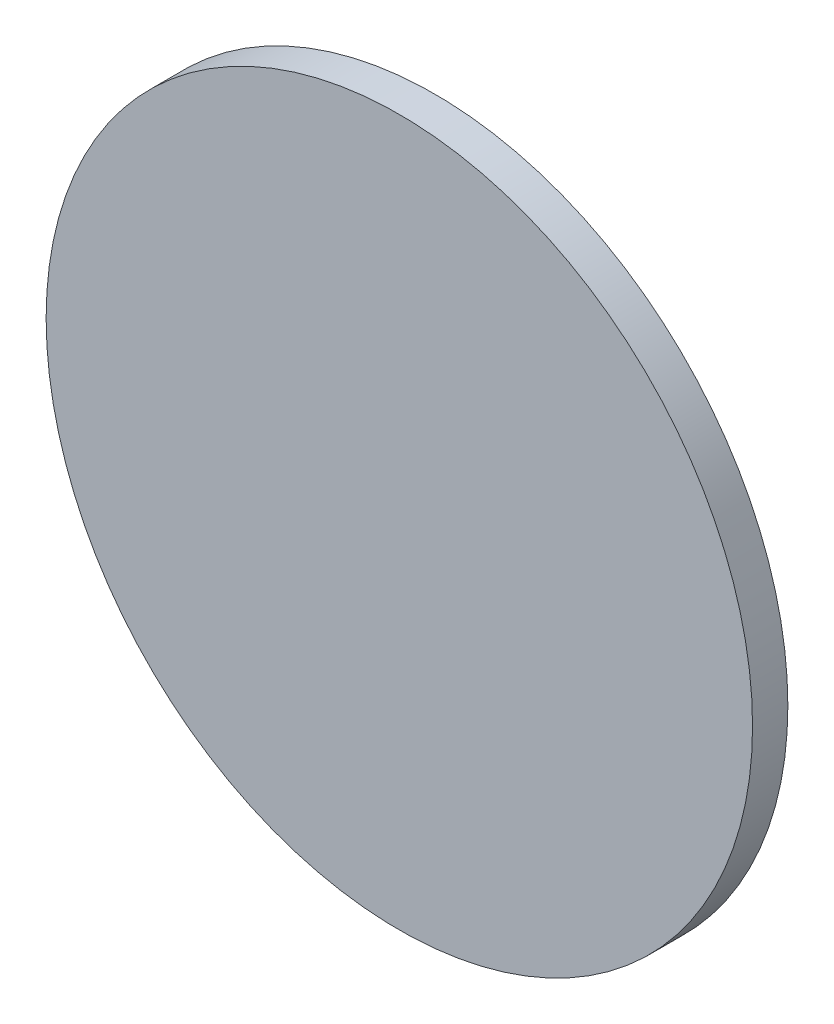
ISO-10303-21;
HEADER;
FILE_DESCRIPTION(('STEP AP214'),'2;1');
FILE_NAME('part.step','',(''),(''),'','','');
FILE_SCHEMA(('AUTOMOTIVE_DESIGN { 1 0 10303 214 1 1 1 1 }'));
ENDSEC;
DATA;
#1=APPLICATION_CONTEXT('core data for automotive mechanical design processes');
#2=APPLICATION_PROTOCOL_DEFINITION('international standard','automotive_design',2000,#1);
#3=PRODUCT_CONTEXT('',#1,'mechanical');
#4=PRODUCT('Part','Part','',(#3));
#5=PRODUCT_RELATED_PRODUCT_CATEGORY('part','',(#4));
#6=PRODUCT_DEFINITION_FORMATION('','',#4);
#7=PRODUCT_DEFINITION_CONTEXT('part definition',#1,'design');
#8=PRODUCT_DEFINITION('design','',#6,#7);
#9=PRODUCT_DEFINITION_SHAPE('','',#8);
#10=(LENGTH_UNIT() NAMED_UNIT(*) SI_UNIT(.MILLI.,.METRE.));
#11=(NAMED_UNIT(*) PLANE_ANGLE_UNIT() SI_UNIT($,.RADIAN.));
#12=(NAMED_UNIT(*) SI_UNIT($,.STERADIAN.) SOLID_ANGLE_UNIT());
#13=UNCERTAINTY_MEASURE_WITH_UNIT(LENGTH_MEASURE(1.E-05),#10,'distance_accuracy_value','');
#14=(GEOMETRIC_REPRESENTATION_CONTEXT(3) GLOBAL_UNCERTAINTY_ASSIGNED_CONTEXT((#13)) GLOBAL_UNIT_ASSIGNED_CONTEXT((#10,
#11,#12)) REPRESENTATION_CONTEXT('',''));
#15=CARTESIAN_POINT('',(0.,0.,0.));
#16=DIRECTION('',(0.,0.,1.));
#17=DIRECTION('',(1.,0.,0.));
#18=AXIS2_PLACEMENT_3D('',#15,#16,#17);
#19=CARTESIAN_POINT('',(0.,0.,4.));
#20=DIRECTION('',(0.,0.,-1.));
#21=DIRECTION('',(-1.,0.,0.));
#22=AXIS2_PLACEMENT_3D('',#19,#20,#21);
#23=CYLINDRICAL_SURFACE('',#22,40.);
#24=CARTESIAN_POINT('',(0.,0.,4.));
#25=DIRECTION('',(0.,0.,1.));
#26=DIRECTION('',(1.,0.,0.));
#27=AXIS2_PLACEMENT_3D('',#24,#25,#26);
#28=CIRCLE('',#27,40.);
#29=CARTESIAN_POINT('',(40.,0.,4.));
#30=VERTEX_POINT('',#29);
#31=EDGE_CURVE('E10',#30,#30,#28,.T.);
#32=ORIENTED_EDGE('',*,*,#31,.F.);
#33=EDGE_LOOP('',(#32));
#34=FACE_BOUND('',#33,.T.);
#35=CARTESIAN_POINT('',(0.,0.,0.));
#36=DIRECTION('',(0.,0.,1.));
#37=DIRECTION('',(1.,0.,0.));
#38=AXIS2_PLACEMENT_3D('',#35,#36,#37);
#39=CIRCLE('',#38,40.);
#40=CARTESIAN_POINT('',(40.,0.,0.));
#41=VERTEX_POINT('',#40);
#42=EDGE_CURVE('E40',#41,#41,#39,.T.);
#43=ORIENTED_EDGE('',*,*,#42,.T.);
#44=EDGE_LOOP('',(#43));
#45=FACE_BOUND('',#44,.T.);
#46=ADVANCED_FACE('F37',(#34,#45),#23,.T.);
#47=CARTESIAN_POINT('',(0.,0.,4.));
#48=DIRECTION('',(0.,0.,1.));
#49=DIRECTION('',(1.,0.,0.));
#50=AXIS2_PLACEMENT_3D('',#47,#48,#49);
#51=PLANE('',#50);
#52=ORIENTED_EDGE('',*,*,#31,.T.);
#53=EDGE_LOOP('',(#52));
#54=FACE_BOUND('',#53,.T.);
#55=ADVANCED_FACE('F54',(#54),#51,.T.);
#56=CARTESIAN_POINT('',(0.,0.,0.));
#57=DIRECTION('',(0.,0.,1.));
#58=DIRECTION('',(1.,0.,0.));
#59=AXIS2_PLACEMENT_3D('',#56,#57,#58);
#60=PLANE('',#59);
#61=ORIENTED_EDGE('',*,*,#42,.F.);
#62=EDGE_LOOP('',(#61));
#63=FACE_BOUND('',#62,.T.);
#64=ADVANCED_FACE('F52',(#63),#60,.F.);
#65=CLOSED_SHELL('',(#46,#55,#64));
#66=MANIFOLD_SOLID_BREP('B2',#65);
#67=ADVANCED_BREP_SHAPE_REPRESENTATION('',(#18,#66),#14);
#68=SHAPE_DEFINITION_REPRESENTATION(#9,#67);
ENDSEC;
END-ISO-10303-21;
